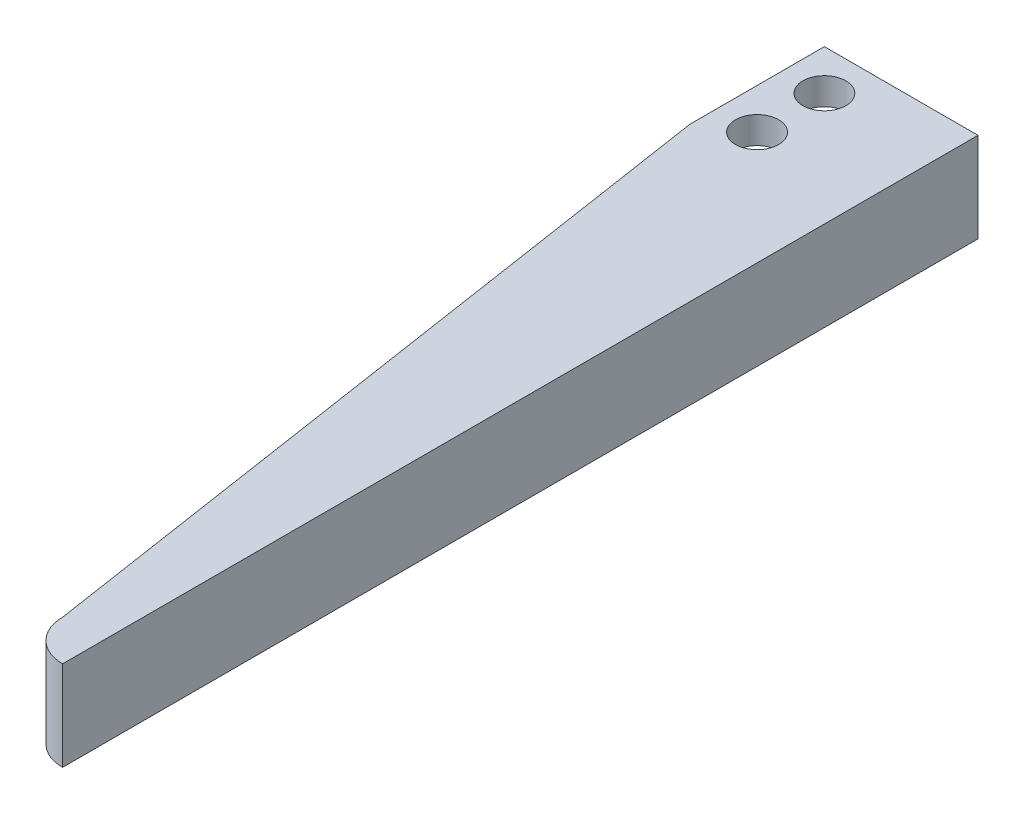
ISO-10303-21;
HEADER;
FILE_DESCRIPTION(('STEP AP214'),'2;1');
FILE_NAME('part.step','',(''),(''),'','','');
FILE_SCHEMA(('AUTOMOTIVE_DESIGN { 1 0 10303 214 1 1 1 1 }'));
ENDSEC;
DATA;
#1=APPLICATION_CONTEXT('core data for automotive mechanical design processes');
#2=APPLICATION_PROTOCOL_DEFINITION('international standard','automotive_design',2000,#1);
#3=PRODUCT_CONTEXT('',#1,'mechanical');
#4=PRODUCT('Part','Part','',(#3));
#5=PRODUCT_RELATED_PRODUCT_CATEGORY('part','',(#4));
#6=PRODUCT_DEFINITION_FORMATION('','',#4);
#7=PRODUCT_DEFINITION_CONTEXT('part definition',#1,'design');
#8=PRODUCT_DEFINITION('design','',#6,#7);
#9=PRODUCT_DEFINITION_SHAPE('','',#8);
#10=(LENGTH_UNIT() NAMED_UNIT(*) SI_UNIT(.MILLI.,.METRE.));
#11=(NAMED_UNIT(*) PLANE_ANGLE_UNIT() SI_UNIT($,.RADIAN.));
#12=(NAMED_UNIT(*) SI_UNIT($,.STERADIAN.) SOLID_ANGLE_UNIT());
#13=UNCERTAINTY_MEASURE_WITH_UNIT(LENGTH_MEASURE(1.E-05),#10,'distance_accuracy_value','');
#14=(GEOMETRIC_REPRESENTATION_CONTEXT(3) GLOBAL_UNCERTAINTY_ASSIGNED_CONTEXT((#13)) GLOBAL_UNIT_ASSIGNED_CONTEXT((#10,
#11,#12)) REPRESENTATION_CONTEXT('',''));
#15=CARTESIAN_POINT('',(0.,0.,0.));
#16=DIRECTION('',(0.,0.,1.));
#17=DIRECTION('',(1.,0.,0.));
#18=AXIS2_PLACEMENT_3D('',#15,#16,#17);
#19=CARTESIAN_POINT('',(5.70625000000002,0.,65.));
#20=DIRECTION('',(0.,1.,0.));
#21=DIRECTION('',(0.,0.,1.));
#22=AXIS2_PLACEMENT_3D('',#19,#20,#21);
#23=PLANE('',#22);
#24=CARTESIAN_POINT('',(-2.70625,0.,8.));
#25=DIRECTION('',(0.,1.,0.));
#26=DIRECTION('',(0.,0.,1.));
#27=AXIS2_PLACEMENT_3D('',#24,#25,#26);
#28=CIRCLE('',#27,1.6);
#29=CARTESIAN_POINT('',(-2.70625,0.,9.6));
#30=VERTEX_POINT('',#29);
#31=EDGE_CURVE('E133',#30,#30,#28,.T.);
#32=ORIENTED_EDGE('',*,*,#31,.T.);
#33=EDGE_LOOP('',(#32));
#34=FACE_BOUND('',#33,.T.);
#35=CARTESIAN_POINT('',(-2.70625,0.,3.));
#36=DIRECTION('',(0.,1.,0.));
#37=DIRECTION('',(0.,0.,1.));
#38=AXIS2_PLACEMENT_3D('',#35,#36,#37);
#39=CIRCLE('',#38,1.6);
#40=CARTESIAN_POINT('',(-2.70625,0.,4.6));
#41=VERTEX_POINT('',#40);
#42=EDGE_CURVE('E144',#41,#41,#39,.T.);
#43=ORIENTED_EDGE('',*,*,#42,.T.);
#44=EDGE_LOOP('',(#43));
#45=FACE_BOUND('',#44,.T.);
#46=DIRECTION('',(0.,0.,-1.));
#47=VECTOR('',#46,1.);
#48=CARTESIAN_POINT('',(2.70625000000002,0.,65.));
#49=LINE('',#48,#47);
#50=CARTESIAN_POINT('',(2.70625000000002,0.,65.));
#51=VERTEX_POINT('',#50);
#52=CARTESIAN_POINT('',(2.70625000000003,0.,0.));
#53=VERTEX_POINT('',#52);
#54=EDGE_CURVE('E65',#51,#53,#49,.T.);
#55=ORIENTED_EDGE('',*,*,#54,.F.);
#56=DIRECTION('',(0.151196146520445,0.,0.988503781114351));
#57=VECTOR('',#56,1.);
#58=CARTESIAN_POINT('',(-5.70625,0.,10.));
#59=LINE('',#58,#57);
#60=CARTESIAN_POINT('',(-5.70625,0.,10.));
#61=VERTEX_POINT('',#60);
#62=EDGE_CURVE('E118',#61,#51,#59,.T.);
#63=ORIENTED_EDGE('',*,*,#62,.F.);
#64=DIRECTION('',(0.,0.,1.));
#65=VECTOR('',#64,1.);
#66=CARTESIAN_POINT('',(-5.70625,0.,0.));
#67=LINE('',#66,#65);
#68=CARTESIAN_POINT('',(-5.70625,0.,0.));
#69=VERTEX_POINT('',#68);
#70=EDGE_CURVE('E115',#69,#61,#67,.T.);
#71=ORIENTED_EDGE('',*,*,#70,.F.);
#72=DIRECTION('',(-1.,0.,0.));
#73=VECTOR('',#72,1.);
#74=CARTESIAN_POINT('',(-5.70625,0.,0.));
#75=LINE('',#74,#73);
#76=EDGE_CURVE('E71',#53,#69,#75,.T.);
#77=ORIENTED_EDGE('',*,*,#76,.F.);
#78=EDGE_LOOP('',(#55,#63,#71,#77));
#79=FACE_BOUND('',#78,.T.);
#80=ADVANCED_FACE('F34',(#34,#45,#79),#23,.F.);
#81=CARTESIAN_POINT('',(5.70625000000002,2.,65.));
#82=DIRECTION('',(0.,1.,0.));
#83=DIRECTION('',(0.,0.,1.));
#84=AXIS2_PLACEMENT_3D('',#81,#82,#83);
#85=PLANE('',#84);
#86=CARTESIAN_POINT('',(-2.70625,2.,3.));
#87=DIRECTION('',(0.,1.,0.));
#88=DIRECTION('',(0.,0.,1.));
#89=AXIS2_PLACEMENT_3D('',#86,#87,#88);
#90=CIRCLE('',#89,1.6);
#91=CARTESIAN_POINT('',(-2.70625,2.,4.6));
#92=VERTEX_POINT('',#91);
#93=EDGE_CURVE('E119',#92,#92,#90,.T.);
#94=ORIENTED_EDGE('',*,*,#93,.F.);
#95=EDGE_LOOP('',(#94));
#96=FACE_BOUND('',#95,.T.);
#97=DIRECTION('',(0.,0.,1.));
#98=VECTOR('',#97,1.);
#99=CARTESIAN_POINT('',(-5.70625,2.,0.));
#100=LINE('',#99,#98);
#101=CARTESIAN_POINT('',(-5.70625,2.,0.));
#102=VERTEX_POINT('',#101);
#103=CARTESIAN_POINT('',(-5.70625,2.,10.));
#104=VERTEX_POINT('',#103);
#105=EDGE_CURVE('E122',#102,#104,#100,.T.);
#106=ORIENTED_EDGE('',*,*,#105,.T.);
#107=DIRECTION('',(0.151196146520445,0.,0.988503781114351));
#108=VECTOR('',#107,1.);
#109=CARTESIAN_POINT('',(-5.70625,2.,10.));
#110=LINE('',#109,#108);
#111=CARTESIAN_POINT('',(2.70625000000002,2.,65.));
#112=VERTEX_POINT('',#111);
#113=EDGE_CURVE('E79',#104,#112,#110,.T.);
#114=ORIENTED_EDGE('',*,*,#113,.T.);
#115=CARTESIAN_POINT('',(5.70625000000002,2.,65.));
#116=DIRECTION('',(0.,1.,0.));
#117=DIRECTION('',(0.,0.,1.));
#118=AXIS2_PLACEMENT_3D('',#115,#116,#117);
#119=CIRCLE('',#118,3.);
#120=CARTESIAN_POINT('',(5.70625000000001,2.,68.));
#121=VERTEX_POINT('',#120);
#122=EDGE_CURVE('E86',#112,#121,#119,.T.);
#123=ORIENTED_EDGE('',*,*,#122,.T.);
#124=DIRECTION('',(0.,0.,-1.));
#125=VECTOR('',#124,1.);
#126=CARTESIAN_POINT('',(5.70625000000001,2.,68.));
#127=LINE('',#126,#125);
#128=CARTESIAN_POINT('',(5.70625,2.,0.));
#129=VERTEX_POINT('',#128);
#130=EDGE_CURVE('E91',#121,#129,#127,.T.);
#131=ORIENTED_EDGE('',*,*,#130,.T.);
#132=DIRECTION('',(-1.,0.,0.));
#133=VECTOR('',#132,1.);
#134=CARTESIAN_POINT('',(-5.70625,2.,0.));
#135=LINE('',#134,#133);
#136=EDGE_CURVE('E51',#129,#102,#135,.T.);
#137=ORIENTED_EDGE('',*,*,#136,.T.);
#138=EDGE_LOOP('',(#106,#114,#123,#131,#137));
#139=FACE_BOUND('',#138,.T.);
#140=CARTESIAN_POINT('',(-2.70625,2.,8.));
#141=DIRECTION('',(0.,1.,0.));
#142=DIRECTION('',(0.,0.,1.));
#143=AXIS2_PLACEMENT_3D('',#140,#141,#142);
#144=CIRCLE('',#143,1.6);
#145=CARTESIAN_POINT('',(-2.70625,2.,9.6));
#146=VERTEX_POINT('',#145);
#147=EDGE_CURVE('E137',#146,#146,#144,.T.);
#148=ORIENTED_EDGE('',*,*,#147,.F.);
#149=EDGE_LOOP('',(#148));
#150=FACE_BOUND('',#149,.T.);
#151=ADVANCED_FACE('F88',(#96,#139,#150),#85,.T.);
#152=CARTESIAN_POINT('',(-5.70625,2.,0.));
#153=DIRECTION('',(1.,0.,0.));
#154=DIRECTION('',(0.,0.,-1.));
#155=AXIS2_PLACEMENT_3D('',#152,#153,#154);
#156=PLANE('',#155);
#157=ORIENTED_EDGE('',*,*,#70,.T.);
#158=DIRECTION('',(0.,-1.,0.));
#159=VECTOR('',#158,1.);
#160=CARTESIAN_POINT('',(-5.70625,2.,10.));
#161=LINE('',#160,#159);
#162=EDGE_CURVE('E11',#104,#61,#161,.T.);
#163=ORIENTED_EDGE('',*,*,#162,.F.);
#164=ORIENTED_EDGE('',*,*,#105,.F.);
#165=DIRECTION('',(0.,-1.,0.));
#166=VECTOR('',#165,1.);
#167=CARTESIAN_POINT('',(-5.70625,2.,0.));
#168=LINE('',#167,#166);
#169=EDGE_CURVE('E111',#102,#69,#168,.T.);
#170=ORIENTED_EDGE('',*,*,#169,.T.);
#171=EDGE_LOOP('',(#157,#163,#164,#170));
#172=FACE_BOUND('',#171,.T.);
#173=ADVANCED_FACE('F36',(#172),#156,.F.);
#174=CARTESIAN_POINT('',(-5.70625,2.,10.));
#175=DIRECTION('',(0.988503781114351,0.,-0.151196146520445));
#176=DIRECTION('',(-0.151196146520445,0.,-0.988503781114351));
#177=AXIS2_PLACEMENT_3D('',#174,#175,#176);
#178=PLANE('',#177);
#179=ORIENTED_EDGE('',*,*,#62,.T.);
#180=DIRECTION('',(0.,-1.,0.));
#181=VECTOR('',#180,1.);
#182=CARTESIAN_POINT('',(2.70625000000002,2.,65.));
#183=LINE('',#182,#181);
#184=EDGE_CURVE('E43',#112,#51,#183,.T.);
#185=ORIENTED_EDGE('',*,*,#184,.F.);
#186=ORIENTED_EDGE('',*,*,#113,.F.);
#187=ORIENTED_EDGE('',*,*,#162,.T.);
#188=EDGE_LOOP('',(#179,#185,#186,#187));
#189=FACE_BOUND('',#188,.T.);
#190=ADVANCED_FACE('F154',(#189),#178,.F.);
#191=CARTESIAN_POINT('',(5.70625000000002,2.,65.));
#192=DIRECTION('',(0.,-1.,0.));
#193=DIRECTION('',(0.,0.,-1.));
#194=AXIS2_PLACEMENT_3D('',#191,#192,#193);
#195=CYLINDRICAL_SURFACE('',#194,3.);
#196=ORIENTED_EDGE('',*,*,#184,.T.);
#197=DIRECTION('',(0.,1.,0.));
#198=VECTOR('',#197,1.);
#199=CARTESIAN_POINT('',(2.70625000000002,-4.6625,65.));
#200=LINE('',#199,#198);
#201=CARTESIAN_POINT('',(2.70625000000002,-4.6625,65.));
#202=VERTEX_POINT('',#201);
#203=EDGE_CURVE('E126',#202,#51,#200,.T.);
#204=ORIENTED_EDGE('',*,*,#203,.F.);
#205=CARTESIAN_POINT('',(5.70625000000002,-4.6625,65.));
#206=DIRECTION('',(0.,-1.,0.));
#207=DIRECTION('',(0.,0.,-1.));
#208=AXIS2_PLACEMENT_3D('',#205,#206,#207);
#209=CIRCLE('',#208,3.);
#210=CARTESIAN_POINT('',(5.70625000000001,-4.6625,68.));
#211=VERTEX_POINT('',#210);
#212=EDGE_CURVE('E102',#211,#202,#209,.T.);
#213=ORIENTED_EDGE('',*,*,#212,.F.);
#214=DIRECTION('',(0.,-1.,0.));
#215=VECTOR('',#214,1.);
#216=CARTESIAN_POINT('',(5.70625000000001,2.,68.));
#217=LINE('',#216,#215);
#218=EDGE_CURVE('E98',#121,#211,#217,.T.);
#219=ORIENTED_EDGE('',*,*,#218,.F.);
#220=ORIENTED_EDGE('',*,*,#122,.F.);
#221=EDGE_LOOP('',(#196,#204,#213,#219,#220));
#222=FACE_BOUND('',#221,.T.);
#223=ADVANCED_FACE('F99',(#222),#195,.T.);
#224=CARTESIAN_POINT('',(5.70625000000001,2.,68.));
#225=DIRECTION('',(-1.,0.,0.));
#226=DIRECTION('',(0.,0.,1.));
#227=AXIS2_PLACEMENT_3D('',#224,#225,#226);
#228=PLANE('',#227);
#229=ORIENTED_EDGE('',*,*,#218,.T.);
#230=DIRECTION('',(0.,0.,1.));
#231=VECTOR('',#230,1.);
#232=CARTESIAN_POINT('',(5.70625000000001,-4.6625,68.));
#233=LINE('',#232,#231);
#234=CARTESIAN_POINT('',(5.70625000000002,-4.6625,0.));
#235=VERTEX_POINT('',#234);
#236=EDGE_CURVE('E139',#235,#211,#233,.T.);
#237=ORIENTED_EDGE('',*,*,#236,.F.);
#238=DIRECTION('',(0.,-1.,0.));
#239=VECTOR('',#238,1.);
#240=CARTESIAN_POINT('',(5.70625,2.,0.));
#241=LINE('',#240,#239);
#242=EDGE_CURVE('E106',#129,#235,#241,.T.);
#243=ORIENTED_EDGE('',*,*,#242,.F.);
#244=ORIENTED_EDGE('',*,*,#130,.F.);
#245=EDGE_LOOP('',(#229,#237,#243,#244));
#246=FACE_BOUND('',#245,.T.);
#247=ADVANCED_FACE('F108',(#246),#228,.F.);
#248=CARTESIAN_POINT('',(-5.70625,2.,0.));
#249=DIRECTION('',(0.,0.,1.));
#250=DIRECTION('',(1.,0.,0.));
#251=AXIS2_PLACEMENT_3D('',#248,#249,#250);
#252=PLANE('',#251);
#253=ORIENTED_EDGE('',*,*,#242,.T.);
#254=DIRECTION('',(1.,0.,0.));
#255=VECTOR('',#254,1.);
#256=CARTESIAN_POINT('',(5.70625000000002,-4.6625,0.));
#257=LINE('',#256,#255);
#258=CARTESIAN_POINT('',(2.70625000000003,-4.6625,0.));
#259=VERTEX_POINT('',#258);
#260=EDGE_CURVE('E163',#259,#235,#257,.T.);
#261=ORIENTED_EDGE('',*,*,#260,.F.);
#262=DIRECTION('',(0.,1.,0.));
#263=VECTOR('',#262,1.);
#264=CARTESIAN_POINT('',(2.70625000000003,-4.6625,0.));
#265=LINE('',#264,#263);
#266=EDGE_CURVE('E134',#259,#53,#265,.T.);
#267=ORIENTED_EDGE('',*,*,#266,.T.);
#268=ORIENTED_EDGE('',*,*,#76,.T.);
#269=ORIENTED_EDGE('',*,*,#169,.F.);
#270=ORIENTED_EDGE('',*,*,#136,.F.);
#271=EDGE_LOOP('',(#253,#261,#267,#268,#269,#270));
#272=FACE_BOUND('',#271,.T.);
#273=ADVANCED_FACE('F162',(#272),#252,.F.);
#274=CARTESIAN_POINT('',(-2.70625,2.,3.));
#275=DIRECTION('',(0.,-1.,0.));
#276=DIRECTION('',(0.,0.,-1.));
#277=AXIS2_PLACEMENT_3D('',#274,#275,#276);
#278=CYLINDRICAL_SURFACE('',#277,1.6);
#279=ORIENTED_EDGE('',*,*,#93,.T.);
#280=EDGE_LOOP('',(#279));
#281=FACE_BOUND('',#280,.T.);
#282=ORIENTED_EDGE('',*,*,#42,.F.);
#283=EDGE_LOOP('',(#282));
#284=FACE_BOUND('',#283,.T.);
#285=ADVANCED_FACE('F190',(#281,#284),#278,.F.);
#286=CARTESIAN_POINT('',(-2.70625,2.,8.));
#287=DIRECTION('',(0.,-1.,0.));
#288=DIRECTION('',(0.,0.,-1.));
#289=AXIS2_PLACEMENT_3D('',#286,#287,#288);
#290=CYLINDRICAL_SURFACE('',#289,1.6);
#291=ORIENTED_EDGE('',*,*,#147,.T.);
#292=EDGE_LOOP('',(#291));
#293=FACE_BOUND('',#292,.T.);
#294=ORIENTED_EDGE('',*,*,#31,.F.);
#295=EDGE_LOOP('',(#294));
#296=FACE_BOUND('',#295,.T.);
#297=ADVANCED_FACE('F175',(#293,#296),#290,.F.);
#298=CARTESIAN_POINT('',(2.70625000000002,-4.6625,65.));
#299=DIRECTION('',(1.,0.,0.));
#300=DIRECTION('',(0.,0.,-1.));
#301=AXIS2_PLACEMENT_3D('',#298,#299,#300);
#302=PLANE('',#301);
#303=ORIENTED_EDGE('',*,*,#54,.T.);
#304=ORIENTED_EDGE('',*,*,#266,.F.);
#305=DIRECTION('',(0.,0.,-1.));
#306=VECTOR('',#305,1.);
#307=CARTESIAN_POINT('',(2.70625000000002,-4.6625,65.));
#308=LINE('',#307,#306);
#309=EDGE_CURVE('E132',#202,#259,#308,.T.);
#310=ORIENTED_EDGE('',*,*,#309,.F.);
#311=ORIENTED_EDGE('',*,*,#203,.T.);
#312=EDGE_LOOP('',(#303,#304,#310,#311));
#313=FACE_BOUND('',#312,.T.);
#314=ADVANCED_FACE('F129',(#313),#302,.F.);
#315=CARTESIAN_POINT('',(5.70625000000002,-4.6625,65.));
#316=DIRECTION('',(0.,-1.,0.));
#317=DIRECTION('',(0.,0.,-1.));
#318=AXIS2_PLACEMENT_3D('',#315,#316,#317);
#319=PLANE('',#318);
#320=ORIENTED_EDGE('',*,*,#212,.T.);
#321=ORIENTED_EDGE('',*,*,#309,.T.);
#322=ORIENTED_EDGE('',*,*,#260,.T.);
#323=ORIENTED_EDGE('',*,*,#236,.T.);
#324=EDGE_LOOP('',(#320,#321,#322,#323));
#325=FACE_BOUND('',#324,.T.);
#326=ADVANCED_FACE('F165',(#325),#319,.T.);
#327=CLOSED_SHELL('',(#80,#151,#173,#190,#223,#247,#273,#285,#297,#314,#326));
#328=MANIFOLD_SOLID_BREP('B2',#327);
#329=ADVANCED_BREP_SHAPE_REPRESENTATION('',(#18,#328),#14);
#330=SHAPE_DEFINITION_REPRESENTATION(#9,#329);
ENDSEC;
END-ISO-10303-21;
